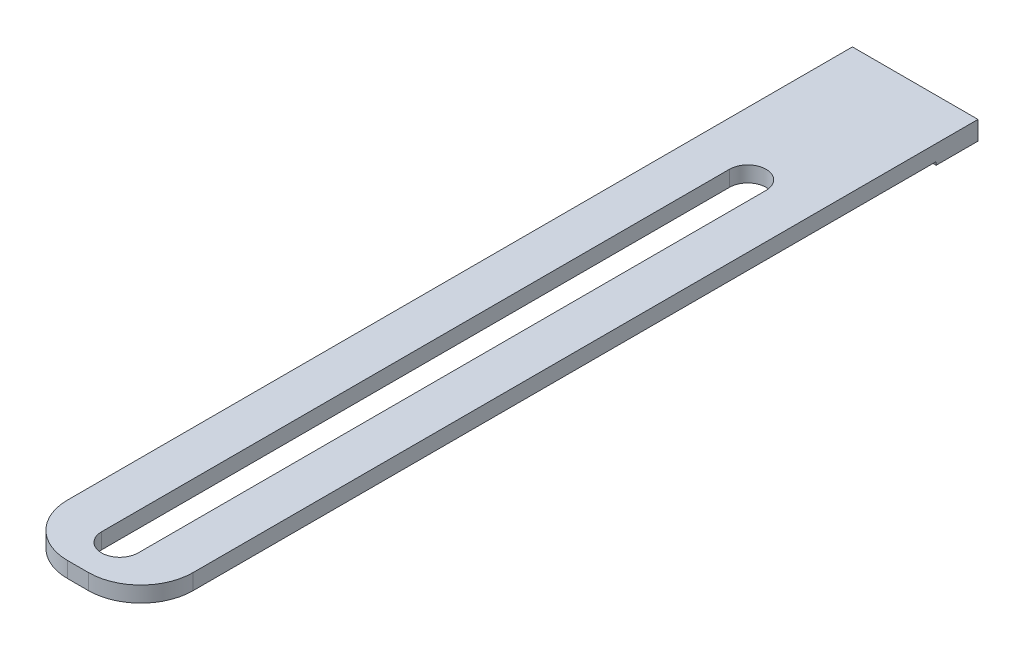
ISO-10303-21;
HEADER;
FILE_DESCRIPTION(('STEP AP214'),'2;1');
FILE_NAME('part.step','',(''),(''),'','','');
FILE_SCHEMA(('AUTOMOTIVE_DESIGN { 1 0 10303 214 1 1 1 1 }'));
ENDSEC;
DATA;
#1=APPLICATION_CONTEXT('core data for automotive mechanical design processes');
#2=APPLICATION_PROTOCOL_DEFINITION('international standard','automotive_design',2000,#1);
#3=PRODUCT_CONTEXT('',#1,'mechanical');
#4=PRODUCT('Part','Part','',(#3));
#5=PRODUCT_RELATED_PRODUCT_CATEGORY('part','',(#4));
#6=PRODUCT_DEFINITION_FORMATION('','',#4);
#7=PRODUCT_DEFINITION_CONTEXT('part definition',#1,'design');
#8=PRODUCT_DEFINITION('design','',#6,#7);
#9=PRODUCT_DEFINITION_SHAPE('','',#8);
#10=(LENGTH_UNIT() NAMED_UNIT(*) SI_UNIT(.MILLI.,.METRE.));
#11=(NAMED_UNIT(*) PLANE_ANGLE_UNIT() SI_UNIT($,.RADIAN.));
#12=(NAMED_UNIT(*) SI_UNIT($,.STERADIAN.) SOLID_ANGLE_UNIT());
#13=UNCERTAINTY_MEASURE_WITH_UNIT(LENGTH_MEASURE(1.E-05),#10,'distance_accuracy_value','');
#14=(GEOMETRIC_REPRESENTATION_CONTEXT(3) GLOBAL_UNCERTAINTY_ASSIGNED_CONTEXT((#13)) GLOBAL_UNIT_ASSIGNED_CONTEXT((#10,
#11,#12)) REPRESENTATION_CONTEXT('',''));
#15=CARTESIAN_POINT('',(0.,0.,0.));
#16=DIRECTION('',(0.,0.,1.));
#17=DIRECTION('',(1.,0.,0.));
#18=AXIS2_PLACEMENT_3D('',#15,#16,#17);
#19=CARTESIAN_POINT('',(-0.999999999999996,0.,35.));
#20=DIRECTION('',(0.,1.,0.));
#21=DIRECTION('',(0.,0.,1.));
#22=AXIS2_PLACEMENT_3D('',#19,#20,#21);
#23=PLANE('',#22);
#24=CARTESIAN_POINT('',(0.,0.,36.));
#25=DIRECTION('',(0.,1.,0.));
#26=DIRECTION('',(0.,0.,1.));
#27=AXIS2_PLACEMENT_3D('',#24,#25,#26);
#28=CIRCLE('',#27,1.75);
#29=CARTESIAN_POINT('',(-1.75,0.,36.));
#30=VERTEX_POINT('',#29);
#31=CARTESIAN_POINT('',(1.75,0.,36.));
#32=VERTEX_POINT('',#31);
#33=EDGE_CURVE('E155',#30,#32,#28,.T.);
#34=ORIENTED_EDGE('',*,*,#33,.T.);
#35=DIRECTION('',(0.,0.,-1.));
#36=VECTOR('',#35,1.);
#37=CARTESIAN_POINT('',(1.75,0.,36.));
#38=LINE('',#37,#36);
#39=CARTESIAN_POINT('',(1.75,0.,-24.));
#40=VERTEX_POINT('',#39);
#41=EDGE_CURVE('E158',#32,#40,#38,.T.);
#42=ORIENTED_EDGE('',*,*,#41,.T.);
#43=CARTESIAN_POINT('',(0.,0.,-24.));
#44=DIRECTION('',(0.,1.,0.));
#45=DIRECTION('',(0.,0.,1.));
#46=AXIS2_PLACEMENT_3D('',#43,#44,#45);
#47=CIRCLE('',#46,1.75);
#48=CARTESIAN_POINT('',(-1.75,0.,-24.));
#49=VERTEX_POINT('',#48);
#50=EDGE_CURVE('E175',#40,#49,#47,.T.);
#51=ORIENTED_EDGE('',*,*,#50,.T.);
#52=DIRECTION('',(0.,0.,1.));
#53=VECTOR('',#52,1.);
#54=CARTESIAN_POINT('',(-1.75,0.,36.));
#55=LINE('',#54,#53);
#56=EDGE_CURVE('E166',#49,#30,#55,.T.);
#57=ORIENTED_EDGE('',*,*,#56,.T.);
#58=EDGE_LOOP('',(#34,#42,#51,#57));
#59=FACE_BOUND('',#58,.T.);
#60=DIRECTION('',(-1.,0.,0.));
#61=VECTOR('',#60,1.);
#62=CARTESIAN_POINT('',(6.,0.,-36.));
#63=LINE('',#62,#61);
#64=CARTESIAN_POINT('',(6.,0.,-36.));
#65=VERTEX_POINT('',#64);
#66=CARTESIAN_POINT('',(-6.,0.,-36.));
#67=VERTEX_POINT('',#66);
#68=EDGE_CURVE('E56',#65,#67,#63,.T.);
#69=ORIENTED_EDGE('',*,*,#68,.F.);
#70=DIRECTION('',(0.,0.,-1.));
#71=VECTOR('',#70,1.);
#72=CARTESIAN_POINT('',(6.,0.,-40.));
#73=LINE('',#72,#71);
#74=CARTESIAN_POINT('',(6.,0.,35.));
#75=VERTEX_POINT('',#74);
#76=EDGE_CURVE('E154',#75,#65,#73,.T.);
#77=ORIENTED_EDGE('',*,*,#76,.F.);
#78=CARTESIAN_POINT('',(1.00000000000001,0.,35.));
#79=DIRECTION('',(0.,1.,0.));
#80=DIRECTION('',(0.,0.,1.));
#81=AXIS2_PLACEMENT_3D('',#78,#79,#80);
#82=CIRCLE('',#81,5.);
#83=CARTESIAN_POINT('',(0.999999999999971,0.,40.));
#84=VERTEX_POINT('',#83);
#85=EDGE_CURVE('E208',#84,#75,#82,.T.);
#86=ORIENTED_EDGE('',*,*,#85,.F.);
#87=DIRECTION('',(1.,0.,0.));
#88=VECTOR('',#87,1.);
#89=CARTESIAN_POINT('',(-0.99999999999996,0.,40.));
#90=LINE('',#89,#88);
#91=CARTESIAN_POINT('',(-0.99999999999996,0.,40.));
#92=VERTEX_POINT('',#91);
#93=EDGE_CURVE('E206',#92,#84,#90,.T.);
#94=ORIENTED_EDGE('',*,*,#93,.F.);
#95=CARTESIAN_POINT('',(-0.999999999999996,0.,35.));
#96=DIRECTION('',(0.,1.,0.));
#97=DIRECTION('',(0.,0.,1.));
#98=AXIS2_PLACEMENT_3D('',#95,#96,#97);
#99=CIRCLE('',#98,5.);
#100=CARTESIAN_POINT('',(-5.99999999999999,0.,35.));
#101=VERTEX_POINT('',#100);
#102=EDGE_CURVE('E204',#101,#92,#99,.T.);
#103=ORIENTED_EDGE('',*,*,#102,.F.);
#104=DIRECTION('',(0.,0.,1.));
#105=VECTOR('',#104,1.);
#106=CARTESIAN_POINT('',(-6.,0.,-40.));
#107=LINE('',#106,#105);
#108=EDGE_CURVE('E188',#67,#101,#107,.T.);
#109=ORIENTED_EDGE('',*,*,#108,.F.);
#110=EDGE_LOOP('',(#69,#77,#86,#94,#103,#109));
#111=FACE_BOUND('',#110,.T.);
#112=ADVANCED_FACE('F41',(#59,#111),#23,.F.);
#113=CARTESIAN_POINT('',(-0.999999999999996,1.5,35.));
#114=DIRECTION('',(0.,1.,0.));
#115=DIRECTION('',(0.,0.,1.));
#116=AXIS2_PLACEMENT_3D('',#113,#114,#115);
#117=PLANE('',#116);
#118=DIRECTION('',(0.,0.,1.));
#119=VECTOR('',#118,1.);
#120=CARTESIAN_POINT('',(-6.,1.5,-40.));
#121=LINE('',#120,#119);
#122=CARTESIAN_POINT('',(-6.,1.5,-40.));
#123=VERTEX_POINT('',#122);
#124=CARTESIAN_POINT('',(-5.99999999999999,1.5,35.));
#125=VERTEX_POINT('',#124);
#126=EDGE_CURVE('E189',#123,#125,#121,.T.);
#127=ORIENTED_EDGE('',*,*,#126,.T.);
#128=CARTESIAN_POINT('',(-0.999999999999996,1.5,35.));
#129=DIRECTION('',(0.,1.,0.));
#130=DIRECTION('',(0.,0.,1.));
#131=AXIS2_PLACEMENT_3D('',#128,#129,#130);
#132=CIRCLE('',#131,5.);
#133=CARTESIAN_POINT('',(-0.99999999999996,1.5,40.));
#134=VERTEX_POINT('',#133);
#135=EDGE_CURVE('E192',#125,#134,#132,.T.);
#136=ORIENTED_EDGE('',*,*,#135,.T.);
#137=DIRECTION('',(1.,0.,0.));
#138=VECTOR('',#137,1.);
#139=CARTESIAN_POINT('',(-0.99999999999996,1.5,40.));
#140=LINE('',#139,#138);
#141=CARTESIAN_POINT('',(0.999999999999971,1.5,40.));
#142=VERTEX_POINT('',#141);
#143=EDGE_CURVE('E194',#134,#142,#140,.T.);
#144=ORIENTED_EDGE('',*,*,#143,.T.);
#145=CARTESIAN_POINT('',(1.00000000000001,1.5,35.));
#146=DIRECTION('',(0.,1.,0.));
#147=DIRECTION('',(0.,0.,1.));
#148=AXIS2_PLACEMENT_3D('',#145,#146,#147);
#149=CIRCLE('',#148,5.);
#150=CARTESIAN_POINT('',(6.,1.5,35.));
#151=VERTEX_POINT('',#150);
#152=EDGE_CURVE('E196',#142,#151,#149,.T.);
#153=ORIENTED_EDGE('',*,*,#152,.T.);
#154=DIRECTION('',(0.,0.,-1.));
#155=VECTOR('',#154,1.);
#156=CARTESIAN_POINT('',(6.,1.5,-40.));
#157=LINE('',#156,#155);
#158=CARTESIAN_POINT('',(6.,1.5,-40.));
#159=VERTEX_POINT('',#158);
#160=EDGE_CURVE('E198',#151,#159,#157,.T.);
#161=ORIENTED_EDGE('',*,*,#160,.T.);
#162=DIRECTION('',(-1.,0.,0.));
#163=VECTOR('',#162,1.);
#164=CARTESIAN_POINT('',(-6.,1.5,-40.));
#165=LINE('',#164,#163);
#166=EDGE_CURVE('E200',#159,#123,#165,.T.);
#167=ORIENTED_EDGE('',*,*,#166,.T.);
#168=EDGE_LOOP('',(#127,#136,#144,#153,#161,#167));
#169=FACE_BOUND('',#168,.T.);
#170=DIRECTION('',(0.,0.,-1.));
#171=VECTOR('',#170,1.);
#172=CARTESIAN_POINT('',(1.75,1.5,36.));
#173=LINE('',#172,#171);
#174=CARTESIAN_POINT('',(1.75,1.5,36.));
#175=VERTEX_POINT('',#174);
#176=CARTESIAN_POINT('',(1.75,1.5,-24.));
#177=VERTEX_POINT('',#176);
#178=EDGE_CURVE('E165',#175,#177,#173,.T.);
#179=ORIENTED_EDGE('',*,*,#178,.F.);
#180=CARTESIAN_POINT('',(0.,1.5,36.));
#181=DIRECTION('',(0.,1.,0.));
#182=DIRECTION('',(0.,0.,1.));
#183=AXIS2_PLACEMENT_3D('',#180,#181,#182);
#184=CIRCLE('',#183,1.75);
#185=CARTESIAN_POINT('',(-1.75,1.5,36.));
#186=VERTEX_POINT('',#185);
#187=EDGE_CURVE('E163',#186,#175,#184,.T.);
#188=ORIENTED_EDGE('',*,*,#187,.F.);
#189=DIRECTION('',(0.,0.,1.));
#190=VECTOR('',#189,1.);
#191=CARTESIAN_POINT('',(-1.75,1.5,36.));
#192=LINE('',#191,#190);
#193=CARTESIAN_POINT('',(-1.75,1.5,-24.));
#194=VERTEX_POINT('',#193);
#195=EDGE_CURVE('E170',#194,#186,#192,.T.);
#196=ORIENTED_EDGE('',*,*,#195,.F.);
#197=CARTESIAN_POINT('',(0.,1.5,-24.));
#198=DIRECTION('',(0.,1.,0.));
#199=DIRECTION('',(0.,0.,1.));
#200=AXIS2_PLACEMENT_3D('',#197,#198,#199);
#201=CIRCLE('',#200,1.75);
#202=EDGE_CURVE('E168',#177,#194,#201,.T.);
#203=ORIENTED_EDGE('',*,*,#202,.F.);
#204=EDGE_LOOP('',(#179,#188,#196,#203));
#205=FACE_BOUND('',#204,.T.);
#206=ADVANCED_FACE('F235',(#169,#205),#117,.T.);
#207=CARTESIAN_POINT('',(-6.,1.5,-40.));
#208=DIRECTION('',(1.,0.,0.));
#209=DIRECTION('',(0.,0.,-1.));
#210=AXIS2_PLACEMENT_3D('',#207,#208,#209);
#211=PLANE('',#210);
#212=DIRECTION('',(0.,-1.,0.));
#213=VECTOR('',#212,1.);
#214=CARTESIAN_POINT('',(-6.,1.5,-40.));
#215=LINE('',#214,#213);
#216=CARTESIAN_POINT('',(-6.,-0.3,-40.));
#217=VERTEX_POINT('',#216);
#218=EDGE_CURVE('E202',#123,#217,#215,.T.);
#219=ORIENTED_EDGE('',*,*,#218,.T.);
#220=DIRECTION('',(0.,0.,-1.));
#221=VECTOR('',#220,1.);
#222=CARTESIAN_POINT('',(-6.,-0.3,-40.));
#223=LINE('',#222,#221);
#224=CARTESIAN_POINT('',(-6.,-0.3,-36.));
#225=VERTEX_POINT('',#224);
#226=EDGE_CURVE('E141',#225,#217,#223,.T.);
#227=ORIENTED_EDGE('',*,*,#226,.F.);
#228=DIRECTION('',(0.,1.,0.));
#229=VECTOR('',#228,1.);
#230=CARTESIAN_POINT('',(-6.,-0.3,-36.));
#231=LINE('',#230,#229);
#232=EDGE_CURVE('E137',#225,#67,#231,.T.);
#233=ORIENTED_EDGE('',*,*,#232,.T.);
#234=ORIENTED_EDGE('',*,*,#108,.T.);
#235=DIRECTION('',(0.,-1.,0.));
#236=VECTOR('',#235,1.);
#237=CARTESIAN_POINT('',(-5.99999999999999,1.5,35.));
#238=LINE('',#237,#236);
#239=EDGE_CURVE('E11',#125,#101,#238,.T.);
#240=ORIENTED_EDGE('',*,*,#239,.F.);
#241=ORIENTED_EDGE('',*,*,#126,.F.);
#242=EDGE_LOOP('',(#219,#227,#233,#234,#240,#241));
#243=FACE_BOUND('',#242,.T.);
#244=ADVANCED_FACE('F43',(#243),#211,.F.);
#245=CARTESIAN_POINT('',(-0.999999999999996,1.5,35.));
#246=DIRECTION('',(0.,-1.,0.));
#247=DIRECTION('',(0.,0.,-1.));
#248=AXIS2_PLACEMENT_3D('',#245,#246,#247);
#249=CYLINDRICAL_SURFACE('',#248,5.);
#250=ORIENTED_EDGE('',*,*,#102,.T.);
#251=DIRECTION('',(0.,-1.,0.));
#252=VECTOR('',#251,1.);
#253=CARTESIAN_POINT('',(-0.99999999999996,1.5,40.));
#254=LINE('',#253,#252);
#255=EDGE_CURVE('E49',#134,#92,#254,.T.);
#256=ORIENTED_EDGE('',*,*,#255,.F.);
#257=ORIENTED_EDGE('',*,*,#135,.F.);
#258=ORIENTED_EDGE('',*,*,#239,.T.);
#259=EDGE_LOOP('',(#250,#256,#257,#258));
#260=FACE_BOUND('',#259,.T.);
#261=ADVANCED_FACE('F240',(#260),#249,.T.);
#262=CARTESIAN_POINT('',(-0.99999999999996,1.5,40.));
#263=DIRECTION('',(0.,0.,-1.));
#264=DIRECTION('',(-1.,0.,0.));
#265=AXIS2_PLACEMENT_3D('',#262,#263,#264);
#266=PLANE('',#265);
#267=ORIENTED_EDGE('',*,*,#93,.T.);
#268=DIRECTION('',(0.,-1.,0.));
#269=VECTOR('',#268,1.);
#270=CARTESIAN_POINT('',(0.999999999999971,1.5,40.));
#271=LINE('',#270,#269);
#272=EDGE_CURVE('E216',#142,#84,#271,.T.);
#273=ORIENTED_EDGE('',*,*,#272,.F.);
#274=ORIENTED_EDGE('',*,*,#143,.F.);
#275=ORIENTED_EDGE('',*,*,#255,.T.);
#276=EDGE_LOOP('',(#267,#273,#274,#275));
#277=FACE_BOUND('',#276,.T.);
#278=ADVANCED_FACE('F223',(#277),#266,.F.);
#279=CARTESIAN_POINT('',(1.00000000000001,1.5,35.));
#280=DIRECTION('',(0.,-1.,0.));
#281=DIRECTION('',(0.,0.,-1.));
#282=AXIS2_PLACEMENT_3D('',#279,#280,#281);
#283=CYLINDRICAL_SURFACE('',#282,5.);
#284=ORIENTED_EDGE('',*,*,#85,.T.);
#285=DIRECTION('',(0.,-1.,0.));
#286=VECTOR('',#285,1.);
#287=CARTESIAN_POINT('',(6.,1.5,35.));
#288=LINE('',#287,#286);
#289=EDGE_CURVE('E214',#151,#75,#288,.T.);
#290=ORIENTED_EDGE('',*,*,#289,.F.);
#291=ORIENTED_EDGE('',*,*,#152,.F.);
#292=ORIENTED_EDGE('',*,*,#272,.T.);
#293=EDGE_LOOP('',(#284,#290,#291,#292));
#294=FACE_BOUND('',#293,.T.);
#295=ADVANCED_FACE('F230',(#294),#283,.T.);
#296=CARTESIAN_POINT('',(6.,1.5,-40.));
#297=DIRECTION('',(-1.,0.,0.));
#298=DIRECTION('',(0.,0.,1.));
#299=AXIS2_PLACEMENT_3D('',#296,#297,#298);
#300=PLANE('',#299);
#301=ORIENTED_EDGE('',*,*,#76,.T.);
#302=DIRECTION('',(0.,1.,0.));
#303=VECTOR('',#302,1.);
#304=CARTESIAN_POINT('',(6.,-0.3,-36.));
#305=LINE('',#304,#303);
#306=CARTESIAN_POINT('',(6.,-0.3,-36.));
#307=VERTEX_POINT('',#306);
#308=EDGE_CURVE('E135',#307,#65,#305,.T.);
#309=ORIENTED_EDGE('',*,*,#308,.F.);
#310=DIRECTION('',(0.,0.,1.));
#311=VECTOR('',#310,1.);
#312=CARTESIAN_POINT('',(6.,-0.3,-40.));
#313=LINE('',#312,#311);
#314=CARTESIAN_POINT('',(6.,-0.3,-40.));
#315=VERTEX_POINT('',#314);
#316=EDGE_CURVE('E142',#315,#307,#313,.T.);
#317=ORIENTED_EDGE('',*,*,#316,.F.);
#318=DIRECTION('',(0.,-1.,0.));
#319=VECTOR('',#318,1.);
#320=CARTESIAN_POINT('',(6.,1.5,-40.));
#321=LINE('',#320,#319);
#322=EDGE_CURVE('E212',#159,#315,#321,.T.);
#323=ORIENTED_EDGE('',*,*,#322,.F.);
#324=ORIENTED_EDGE('',*,*,#160,.F.);
#325=ORIENTED_EDGE('',*,*,#289,.T.);
#326=EDGE_LOOP('',(#301,#309,#317,#323,#324,#325));
#327=FACE_BOUND('',#326,.T.);
#328=ADVANCED_FACE('F152',(#327),#300,.F.);
#329=CARTESIAN_POINT('',(-6.,1.5,-40.));
#330=DIRECTION('',(0.,0.,1.));
#331=DIRECTION('',(1.,0.,0.));
#332=AXIS2_PLACEMENT_3D('',#329,#330,#331);
#333=PLANE('',#332);
#334=ORIENTED_EDGE('',*,*,#322,.T.);
#335=DIRECTION('',(1.,0.,0.));
#336=VECTOR('',#335,1.);
#337=CARTESIAN_POINT('',(6.,-0.3,-40.));
#338=LINE('',#337,#336);
#339=EDGE_CURVE('E148',#217,#315,#338,.T.);
#340=ORIENTED_EDGE('',*,*,#339,.F.);
#341=ORIENTED_EDGE('',*,*,#218,.F.);
#342=ORIENTED_EDGE('',*,*,#166,.F.);
#343=EDGE_LOOP('',(#334,#340,#341,#342));
#344=FACE_BOUND('',#343,.T.);
#345=ADVANCED_FACE('F245',(#344),#333,.F.);
#346=CARTESIAN_POINT('',(0.,1.5,36.));
#347=DIRECTION('',(0.,-1.,0.));
#348=DIRECTION('',(0.,0.,-1.));
#349=AXIS2_PLACEMENT_3D('',#346,#347,#348);
#350=CYLINDRICAL_SURFACE('',#349,1.75);
#351=ORIENTED_EDGE('',*,*,#33,.F.);
#352=DIRECTION('',(0.,-1.,0.));
#353=VECTOR('',#352,1.);
#354=CARTESIAN_POINT('',(-1.75,1.5,36.));
#355=LINE('',#354,#353);
#356=EDGE_CURVE('E171',#186,#30,#355,.T.);
#357=ORIENTED_EDGE('',*,*,#356,.F.);
#358=ORIENTED_EDGE('',*,*,#187,.T.);
#359=DIRECTION('',(0.,-1.,0.));
#360=VECTOR('',#359,1.);
#361=CARTESIAN_POINT('',(1.75,1.5,36.));
#362=LINE('',#361,#360);
#363=EDGE_CURVE('E185',#175,#32,#362,.T.);
#364=ORIENTED_EDGE('',*,*,#363,.T.);
#365=EDGE_LOOP('',(#351,#357,#358,#364));
#366=FACE_BOUND('',#365,.T.);
#367=ADVANCED_FACE('F247',(#366),#350,.F.);
#368=CARTESIAN_POINT('',(1.75,1.5,36.));
#369=DIRECTION('',(-1.,0.,0.));
#370=DIRECTION('',(0.,0.,1.));
#371=AXIS2_PLACEMENT_3D('',#368,#369,#370);
#372=PLANE('',#371);
#373=ORIENTED_EDGE('',*,*,#41,.F.);
#374=ORIENTED_EDGE('',*,*,#363,.F.);
#375=ORIENTED_EDGE('',*,*,#178,.T.);
#376=DIRECTION('',(0.,-1.,0.));
#377=VECTOR('',#376,1.);
#378=CARTESIAN_POINT('',(1.75,1.5,-24.));
#379=LINE('',#378,#377);
#380=EDGE_CURVE('E183',#177,#40,#379,.T.);
#381=ORIENTED_EDGE('',*,*,#380,.T.);
#382=EDGE_LOOP('',(#373,#374,#375,#381));
#383=FACE_BOUND('',#382,.T.);
#384=ADVANCED_FACE('F254',(#383),#372,.T.);
#385=CARTESIAN_POINT('',(0.,1.5,-24.));
#386=DIRECTION('',(0.,-1.,0.));
#387=DIRECTION('',(0.,0.,-1.));
#388=AXIS2_PLACEMENT_3D('',#385,#386,#387);
#389=CYLINDRICAL_SURFACE('',#388,1.75);
#390=ORIENTED_EDGE('',*,*,#50,.F.);
#391=ORIENTED_EDGE('',*,*,#380,.F.);
#392=ORIENTED_EDGE('',*,*,#202,.T.);
#393=DIRECTION('',(0.,-1.,0.));
#394=VECTOR('',#393,1.);
#395=CARTESIAN_POINT('',(-1.75,1.5,-24.));
#396=LINE('',#395,#394);
#397=EDGE_CURVE('E64',#194,#49,#396,.T.);
#398=ORIENTED_EDGE('',*,*,#397,.T.);
#399=EDGE_LOOP('',(#390,#391,#392,#398));
#400=FACE_BOUND('',#399,.T.);
#401=ADVANCED_FACE('F270',(#400),#389,.F.);
#402=CARTESIAN_POINT('',(-1.75,1.5,36.));
#403=DIRECTION('',(1.,0.,0.));
#404=DIRECTION('',(0.,0.,-1.));
#405=AXIS2_PLACEMENT_3D('',#402,#403,#404);
#406=PLANE('',#405);
#407=ORIENTED_EDGE('',*,*,#56,.F.);
#408=ORIENTED_EDGE('',*,*,#397,.F.);
#409=ORIENTED_EDGE('',*,*,#195,.T.);
#410=ORIENTED_EDGE('',*,*,#356,.T.);
#411=EDGE_LOOP('',(#407,#408,#409,#410));
#412=FACE_BOUND('',#411,.T.);
#413=ADVANCED_FACE('F274',(#412),#406,.T.);
#414=CARTESIAN_POINT('',(6.,-0.3,-36.));
#415=DIRECTION('',(0.,0.,-1.));
#416=DIRECTION('',(-1.,0.,0.));
#417=AXIS2_PLACEMENT_3D('',#414,#415,#416);
#418=PLANE('',#417);
#419=ORIENTED_EDGE('',*,*,#68,.T.);
#420=ORIENTED_EDGE('',*,*,#232,.F.);
#421=DIRECTION('',(-1.,0.,0.));
#422=VECTOR('',#421,1.);
#423=CARTESIAN_POINT('',(6.,-0.3,-36.));
#424=LINE('',#423,#422);
#425=EDGE_CURVE('E131',#307,#225,#424,.T.);
#426=ORIENTED_EDGE('',*,*,#425,.F.);
#427=ORIENTED_EDGE('',*,*,#308,.T.);
#428=EDGE_LOOP('',(#419,#420,#426,#427));
#429=FACE_BOUND('',#428,.T.);
#430=ADVANCED_FACE('F133',(#429),#418,.F.);
#431=CARTESIAN_POINT('',(0.,-0.3,0.));
#432=DIRECTION('',(0.,-1.,0.));
#433=DIRECTION('',(0.,0.,-1.));
#434=AXIS2_PLACEMENT_3D('',#431,#432,#433);
#435=PLANE('',#434);
#436=ORIENTED_EDGE('',*,*,#316,.T.);
#437=ORIENTED_EDGE('',*,*,#425,.T.);
#438=ORIENTED_EDGE('',*,*,#226,.T.);
#439=ORIENTED_EDGE('',*,*,#339,.T.);
#440=EDGE_LOOP('',(#436,#437,#438,#439));
#441=FACE_BOUND('',#440,.T.);
#442=ADVANCED_FACE('F146',(#441),#435,.T.);
#443=CLOSED_SHELL('',(#112,#206,#244,#261,#278,#295,#328,#345,#367,#384,#401,#413,#430,#442));
#444=MANIFOLD_SOLID_BREP('B2',#443);
#445=ADVANCED_BREP_SHAPE_REPRESENTATION('',(#18,#444),#14);
#446=SHAPE_DEFINITION_REPRESENTATION(#9,#445);
ENDSEC;
END-ISO-10303-21;
